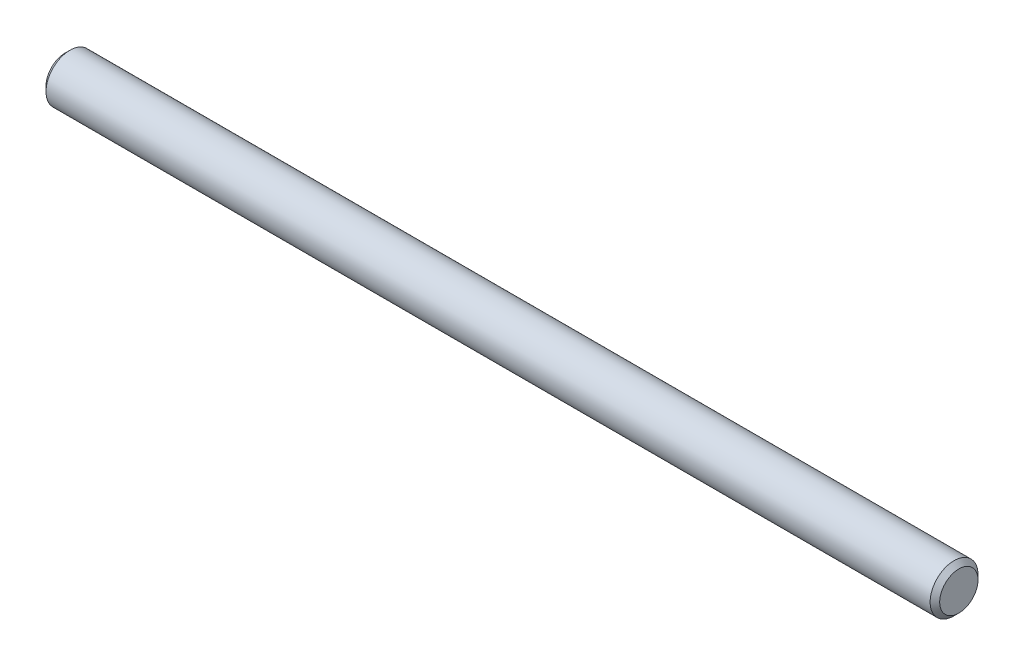
ISO-10303-21;
HEADER;
FILE_DESCRIPTION(('STEP AP214'),'2;1');
FILE_NAME('part.step','',(''),(''),'','','');
FILE_SCHEMA(('AUTOMOTIVE_DESIGN { 1 0 10303 214 1 1 1 1 }'));
ENDSEC;
DATA;
#1=APPLICATION_CONTEXT('core data for automotive mechanical design processes');
#2=APPLICATION_PROTOCOL_DEFINITION('international standard','automotive_design',2000,#1);
#3=PRODUCT_CONTEXT('',#1,'mechanical');
#4=PRODUCT('Part','Part','',(#3));
#5=PRODUCT_RELATED_PRODUCT_CATEGORY('part','',(#4));
#6=PRODUCT_DEFINITION_FORMATION('','',#4);
#7=PRODUCT_DEFINITION_CONTEXT('part definition',#1,'design');
#8=PRODUCT_DEFINITION('design','',#6,#7);
#9=PRODUCT_DEFINITION_SHAPE('','',#8);
#10=(LENGTH_UNIT() NAMED_UNIT(*) SI_UNIT(.MILLI.,.METRE.));
#11=(NAMED_UNIT(*) PLANE_ANGLE_UNIT() SI_UNIT($,.RADIAN.));
#12=(NAMED_UNIT(*) SI_UNIT($,.STERADIAN.) SOLID_ANGLE_UNIT());
#13=UNCERTAINTY_MEASURE_WITH_UNIT(LENGTH_MEASURE(1.E-05),#10,'distance_accuracy_value','');
#14=(GEOMETRIC_REPRESENTATION_CONTEXT(3) GLOBAL_UNCERTAINTY_ASSIGNED_CONTEXT((#13)) GLOBAL_UNIT_ASSIGNED_CONTEXT((#10,
#11,#12)) REPRESENTATION_CONTEXT('',''));
#15=CARTESIAN_POINT('',(0.,0.,0.));
#16=DIRECTION('',(0.,0.,1.));
#17=DIRECTION('',(1.,0.,0.));
#18=AXIS2_PLACEMENT_3D('',#15,#16,#17);
#19=CARTESIAN_POINT('',(-88.9,0.,0.));
#20=DIRECTION('',(1.,0.,0.));
#21=DIRECTION('',(0.,0.,-1.));
#22=AXIS2_PLACEMENT_3D('',#19,#20,#21);
#23=CYLINDRICAL_SURFACE('',#22,4.7625);
#24=CARTESIAN_POINT('',(87.9475,0.,0.));
#25=DIRECTION('',(1.,0.,0.));
#26=DIRECTION('',(0.,0.,-1.));
#27=AXIS2_PLACEMENT_3D('',#24,#25,#26);
#28=CIRCLE('',#27,4.7625);
#29=CARTESIAN_POINT('',(87.9475,0.,-4.7625));
#30=VERTEX_POINT('',#29);
#31=EDGE_CURVE('E38',#30,#30,#28,.F.);
#32=ORIENTED_EDGE('',*,*,#31,.T.);
#33=EDGE_LOOP('',(#32));
#34=FACE_BOUND('',#33,.T.);
#35=CARTESIAN_POINT('',(-87.9475,0.,0.));
#36=DIRECTION('',(1.,0.,0.));
#37=DIRECTION('',(0.,0.,-1.));
#38=AXIS2_PLACEMENT_3D('',#35,#36,#37);
#39=CIRCLE('',#38,4.7625);
#40=CARTESIAN_POINT('',(-87.9475,0.,-4.7625));
#41=VERTEX_POINT('',#40);
#42=EDGE_CURVE('E42',#41,#41,#39,.T.);
#43=ORIENTED_EDGE('',*,*,#42,.T.);
#44=EDGE_LOOP('',(#43));
#45=FACE_BOUND('',#44,.T.);
#46=ADVANCED_FACE('F31',(#34,#45),#23,.T.);
#47=CARTESIAN_POINT('',(-88.9,0.,0.));
#48=DIRECTION('',(1.,0.,0.));
#49=DIRECTION('',(0.,0.,-1.));
#50=AXIS2_PLACEMENT_3D('',#47,#48,#49);
#51=PLANE('',#50);
#52=CARTESIAN_POINT('',(-88.9,0.,0.));
#53=DIRECTION('',(1.,0.,0.));
#54=DIRECTION('',(0.,0.,-1.));
#55=AXIS2_PLACEMENT_3D('',#52,#53,#54);
#56=CIRCLE('',#55,3.80999999999997);
#57=CARTESIAN_POINT('',(-88.9,0.,-3.80999999999997));
#58=VERTEX_POINT('',#57);
#59=EDGE_CURVE('E10',#58,#58,#56,.F.);
#60=ORIENTED_EDGE('',*,*,#59,.T.);
#61=EDGE_LOOP('',(#60));
#62=FACE_BOUND('',#61,.T.);
#63=ADVANCED_FACE('F62',(#62),#51,.F.);
#64=CARTESIAN_POINT('',(88.9,0.,0.));
#65=DIRECTION('',(1.,0.,0.));
#66=DIRECTION('',(0.,0.,-1.));
#67=AXIS2_PLACEMENT_3D('',#64,#65,#66);
#68=PLANE('',#67);
#69=CARTESIAN_POINT('',(88.9,0.,0.));
#70=DIRECTION('',(1.,0.,0.));
#71=DIRECTION('',(0.,0.,-1.));
#72=AXIS2_PLACEMENT_3D('',#69,#70,#71);
#73=CIRCLE('',#72,3.81000000000008);
#74=CARTESIAN_POINT('',(88.9,0.,-3.81000000000008));
#75=VERTEX_POINT('',#74);
#76=EDGE_CURVE('E46',#75,#75,#73,.T.);
#77=ORIENTED_EDGE('',*,*,#76,.T.);
#78=EDGE_LOOP('',(#77));
#79=FACE_BOUND('',#78,.T.);
#80=ADVANCED_FACE('F52',(#79),#68,.T.);
#81=CARTESIAN_POINT('',(88.9,0.,0.));
#82=DIRECTION('',(-1.,0.,0.));
#83=DIRECTION('',(0.,0.,1.));
#84=AXIS2_PLACEMENT_3D('',#81,#82,#83);
#85=CONICAL_SURFACE('',#84,3.81000000000006,0.785398163397432);
#86=ORIENTED_EDGE('',*,*,#31,.F.);
#87=EDGE_LOOP('',(#86));
#88=FACE_BOUND('',#87,.T.);
#89=ORIENTED_EDGE('',*,*,#76,.F.);
#90=EDGE_LOOP('',(#89));
#91=FACE_BOUND('',#90,.T.);
#92=ADVANCED_FACE('F54',(#88,#91),#85,.T.);
#93=CARTESIAN_POINT('',(-87.9475,0.,0.));
#94=DIRECTION('',(1.,0.,0.));
#95=DIRECTION('',(0.,0.,-1.));
#96=AXIS2_PLACEMENT_3D('',#93,#94,#95);
#97=CONICAL_SURFACE('',#96,4.7625,0.785398163397447);
#98=ORIENTED_EDGE('',*,*,#59,.F.);
#99=EDGE_LOOP('',(#98));
#100=FACE_BOUND('',#99,.T.);
#101=ORIENTED_EDGE('',*,*,#42,.F.);
#102=EDGE_LOOP('',(#101));
#103=FACE_BOUND('',#102,.T.);
#104=ADVANCED_FACE('F33',(#100,#103),#97,.T.);
#105=CLOSED_SHELL('',(#46,#63,#80,#92,#104));
#106=MANIFOLD_SOLID_BREP('B2',#105);
#107=ADVANCED_BREP_SHAPE_REPRESENTATION('',(#18,#106),#14);
#108=SHAPE_DEFINITION_REPRESENTATION(#9,#107);
ENDSEC;
END-ISO-10303-21;
